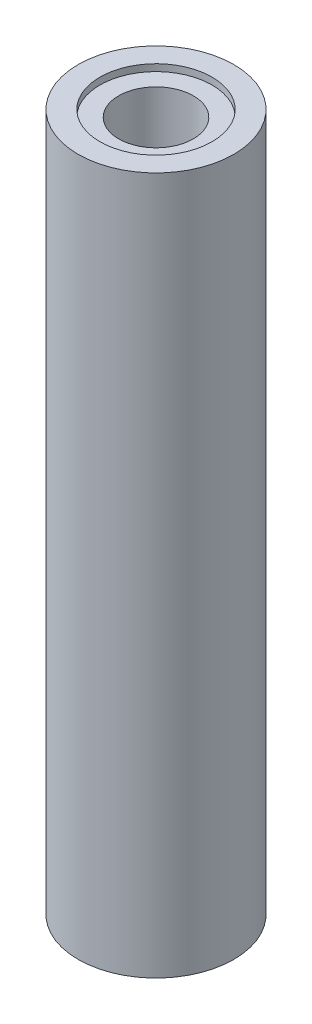
ISO-10303-21;
HEADER;
FILE_DESCRIPTION(('STEP AP214'),'2;1');
FILE_NAME('part.step','',(''),(''),'','','');
FILE_SCHEMA(('AUTOMOTIVE_DESIGN { 1 0 10303 214 1 1 1 1 }'));
ENDSEC;
DATA;
#1=APPLICATION_CONTEXT('core data for automotive mechanical design processes');
#2=APPLICATION_PROTOCOL_DEFINITION('international standard','automotive_design',2000,#1);
#3=PRODUCT_CONTEXT('',#1,'mechanical');
#4=PRODUCT('Part','Part','',(#3));
#5=PRODUCT_RELATED_PRODUCT_CATEGORY('part','',(#4));
#6=PRODUCT_DEFINITION_FORMATION('','',#4);
#7=PRODUCT_DEFINITION_CONTEXT('part definition',#1,'design');
#8=PRODUCT_DEFINITION('design','',#6,#7);
#9=PRODUCT_DEFINITION_SHAPE('','',#8);
#10=(LENGTH_UNIT() NAMED_UNIT(*) SI_UNIT(.MILLI.,.METRE.));
#11=(NAMED_UNIT(*) PLANE_ANGLE_UNIT() SI_UNIT($,.RADIAN.));
#12=(NAMED_UNIT(*) SI_UNIT($,.STERADIAN.) SOLID_ANGLE_UNIT());
#13=UNCERTAINTY_MEASURE_WITH_UNIT(LENGTH_MEASURE(1.E-05),#10,'distance_accuracy_value','');
#14=(GEOMETRIC_REPRESENTATION_CONTEXT(3) GLOBAL_UNCERTAINTY_ASSIGNED_CONTEXT((#13)) GLOBAL_UNIT_ASSIGNED_CONTEXT((#10,
#11,#12)) REPRESENTATION_CONTEXT('',''));
#15=CARTESIAN_POINT('',(0.,0.,0.));
#16=DIRECTION('',(0.,0.,1.));
#17=DIRECTION('',(1.,0.,0.));
#18=AXIS2_PLACEMENT_3D('',#15,#16,#17);
#19=CARTESIAN_POINT('',(0.,117.447860772344,0.));
#20=DIRECTION('',(0.,-1.,0.));
#21=DIRECTION('',(1.,0.,0.));
#22=AXIS2_PLACEMENT_3D('',#19,#20,#21);
#23=CYLINDRICAL_SURFACE('',#22,6.);
#24=CARTESIAN_POINT('',(0.,0.,0.));
#25=DIRECTION('',(0.,-1.,0.));
#26=DIRECTION('',(1.,0.,0.));
#27=AXIS2_PLACEMENT_3D('',#24,#25,#26);
#28=CIRCLE('',#27,6.);
#29=CARTESIAN_POINT('',(6.,0.,0.));
#30=VERTEX_POINT('',#29);
#31=EDGE_CURVE('E18',#30,#30,#28,.F.);
#32=ORIENTED_EDGE('',*,*,#31,.F.);
#33=EDGE_LOOP('',(#32));
#34=FACE_BOUND('',#33,.T.);
#35=CARTESIAN_POINT('',(0.,109.8,0.));
#36=DIRECTION('',(0.,-1.,0.));
#37=DIRECTION('',(1.,0.,0.));
#38=AXIS2_PLACEMENT_3D('',#35,#36,#37);
#39=CIRCLE('',#38,6.);
#40=CARTESIAN_POINT('',(5.99999999999999,109.8,0.));
#41=VERTEX_POINT('',#40);
#42=EDGE_CURVE('E40',#41,#41,#39,.T.);
#43=ORIENTED_EDGE('',*,*,#42,.F.);
#44=EDGE_LOOP('',(#43));
#45=FACE_BOUND('',#44,.T.);
#46=ADVANCED_FACE('F15',(#34,#45),#23,.F.);
#47=CARTESIAN_POINT('',(4.5,0.,0.));
#48=DIRECTION('',(0.,-1.,0.));
#49=DIRECTION('',(0.,0.,-1.));
#50=AXIS2_PLACEMENT_3D('',#47,#48,#49);
#51=PLANE('',#50);
#52=ORIENTED_EDGE('',*,*,#31,.T.);
#53=EDGE_LOOP('',(#52));
#54=FACE_BOUND('',#53,.T.);
#55=CARTESIAN_POINT('',(0.,0.,0.));
#56=DIRECTION('',(0.,-1.,0.));
#57=DIRECTION('',(1.,0.,0.));
#58=AXIS2_PLACEMENT_3D('',#55,#56,#57);
#59=CIRCLE('',#58,9.);
#60=CARTESIAN_POINT('',(9.,0.,0.));
#61=VERTEX_POINT('',#60);
#62=EDGE_CURVE('E38',#61,#61,#59,.T.);
#63=ORIENTED_EDGE('',*,*,#62,.T.);
#64=EDGE_LOOP('',(#63));
#65=FACE_BOUND('',#64,.T.);
#66=ADVANCED_FACE('F47',(#54,#65),#51,.T.);
#67=CARTESIAN_POINT('',(4.49999999999999,109.8,0.));
#68=DIRECTION('',(0.,1.,0.));
#69=DIRECTION('',(0.,0.,1.));
#70=AXIS2_PLACEMENT_3D('',#67,#68,#69);
#71=PLANE('',#70);
#72=ORIENTED_EDGE('',*,*,#42,.T.);
#73=EDGE_LOOP('',(#72));
#74=FACE_BOUND('',#73,.T.);
#75=CARTESIAN_POINT('',(0.,109.8,0.));
#76=DIRECTION('',(0.,-1.,0.));
#77=DIRECTION('',(1.,0.,0.));
#78=AXIS2_PLACEMENT_3D('',#75,#76,#77);
#79=CIRCLE('',#78,9.);
#80=CARTESIAN_POINT('',(8.99999999999999,109.8,0.));
#81=VERTEX_POINT('',#80);
#82=EDGE_CURVE('E35',#81,#81,#79,.F.);
#83=ORIENTED_EDGE('',*,*,#82,.T.);
#84=EDGE_LOOP('',(#83));
#85=FACE_BOUND('',#84,.T.);
#86=ADVANCED_FACE('F56',(#74,#85),#71,.T.);
#87=CARTESIAN_POINT('',(0.,-0.549999999999997,0.));
#88=DIRECTION('',(0.,-1.,0.));
#89=DIRECTION('',(1.,0.,0.));
#90=AXIS2_PLACEMENT_3D('',#87,#88,#89);
#91=CYLINDRICAL_SURFACE('',#90,9.);
#92=CARTESIAN_POINT('',(0.,-1.1,0.));
#93=DIRECTION('',(0.,-1.,0.));
#94=DIRECTION('',(1.,0.,0.));
#95=AXIS2_PLACEMENT_3D('',#92,#93,#94);
#96=CIRCLE('',#95,9.);
#97=CARTESIAN_POINT('',(9.,-1.09999999999999,0.));
#98=VERTEX_POINT('',#97);
#99=EDGE_CURVE('E32',#98,#98,#96,.F.);
#100=ORIENTED_EDGE('',*,*,#99,.F.);
#101=EDGE_LOOP('',(#100));
#102=FACE_BOUND('',#101,.T.);
#103=ORIENTED_EDGE('',*,*,#62,.F.);
#104=EDGE_LOOP('',(#103));
#105=FACE_BOUND('',#104,.T.);
#106=ADVANCED_FACE('F75',(#102,#105),#91,.F.);
#107=CARTESIAN_POINT('',(0.,110.35,0.));
#108=DIRECTION('',(0.,-1.,0.));
#109=DIRECTION('',(1.,0.,0.));
#110=AXIS2_PLACEMENT_3D('',#107,#108,#109);
#111=CYLINDRICAL_SURFACE('',#110,9.);
#112=ORIENTED_EDGE('',*,*,#82,.F.);
#113=EDGE_LOOP('',(#112));
#114=FACE_BOUND('',#113,.T.);
#115=CARTESIAN_POINT('',(0.,110.9,0.));
#116=DIRECTION('',(0.,-1.,0.));
#117=DIRECTION('',(1.,0.,0.));
#118=AXIS2_PLACEMENT_3D('',#115,#116,#117);
#119=CIRCLE('',#118,9.);
#120=CARTESIAN_POINT('',(8.99999999999999,110.9,0.));
#121=VERTEX_POINT('',#120);
#122=EDGE_CURVE('E27',#121,#121,#119,.T.);
#123=ORIENTED_EDGE('',*,*,#122,.F.);
#124=EDGE_LOOP('',(#123));
#125=FACE_BOUND('',#124,.T.);
#126=ADVANCED_FACE('F71',(#114,#125),#111,.F.);
#127=CARTESIAN_POINT('',(10.75,-1.09999999999999,0.));
#128=DIRECTION('',(0.,-1.,0.));
#129=DIRECTION('',(0.,0.,-1.));
#130=AXIS2_PLACEMENT_3D('',#127,#128,#129);
#131=PLANE('',#130);
#132=ORIENTED_EDGE('',*,*,#99,.T.);
#133=EDGE_LOOP('',(#132));
#134=FACE_BOUND('',#133,.T.);
#135=CARTESIAN_POINT('',(0.,-1.1,0.));
#136=DIRECTION('',(0.,-1.,0.));
#137=DIRECTION('',(1.,0.,0.));
#138=AXIS2_PLACEMENT_3D('',#135,#136,#137);
#139=CIRCLE('',#138,12.5);
#140=CARTESIAN_POINT('',(12.5,-1.1,0.));
#141=VERTEX_POINT('',#140);
#142=EDGE_CURVE('E22',#141,#141,#139,.F.);
#143=ORIENTED_EDGE('',*,*,#142,.F.);
#144=EDGE_LOOP('',(#143));
#145=FACE_BOUND('',#144,.T.);
#146=ADVANCED_FACE('F64',(#134,#145),#131,.T.);
#147=CARTESIAN_POINT('',(10.75,110.9,0.));
#148=DIRECTION('',(0.,1.,0.));
#149=DIRECTION('',(0.,0.,1.));
#150=AXIS2_PLACEMENT_3D('',#147,#148,#149);
#151=PLANE('',#150);
#152=ORIENTED_EDGE('',*,*,#122,.T.);
#153=EDGE_LOOP('',(#152));
#154=FACE_BOUND('',#153,.T.);
#155=CARTESIAN_POINT('',(0.,110.9,0.));
#156=DIRECTION('',(0.,-1.,0.));
#157=DIRECTION('',(1.,0.,0.));
#158=AXIS2_PLACEMENT_3D('',#155,#156,#157);
#159=CIRCLE('',#158,12.5);
#160=CARTESIAN_POINT('',(12.5,110.9,0.));
#161=VERTEX_POINT('',#160);
#162=EDGE_CURVE('E10',#161,#161,#159,.T.);
#163=ORIENTED_EDGE('',*,*,#162,.F.);
#164=EDGE_LOOP('',(#163));
#165=FACE_BOUND('',#164,.T.);
#166=ADVANCED_FACE('F59',(#154,#165),#151,.T.);
#167=CARTESIAN_POINT('',(0.,54.9,0.));
#168=DIRECTION('',(0.,-1.,0.));
#169=DIRECTION('',(1.,0.,0.));
#170=AXIS2_PLACEMENT_3D('',#167,#168,#169);
#171=CYLINDRICAL_SURFACE('',#170,12.5);
#172=ORIENTED_EDGE('',*,*,#162,.T.);
#173=EDGE_LOOP('',(#172));
#174=FACE_BOUND('',#173,.T.);
#175=ORIENTED_EDGE('',*,*,#142,.T.);
#176=EDGE_LOOP('',(#175));
#177=FACE_BOUND('',#176,.T.);
#178=ADVANCED_FACE('F57',(#174,#177),#171,.T.);
#179=CLOSED_SHELL('',(#46,#66,#86,#106,#126,#146,#166,#178));
#180=MANIFOLD_SOLID_BREP('B1',#179);
#181=ADVANCED_BREP_SHAPE_REPRESENTATION('',(#18,#180),#14);
#182=SHAPE_DEFINITION_REPRESENTATION(#9,#181);
ENDSEC;
END-ISO-10303-21;
